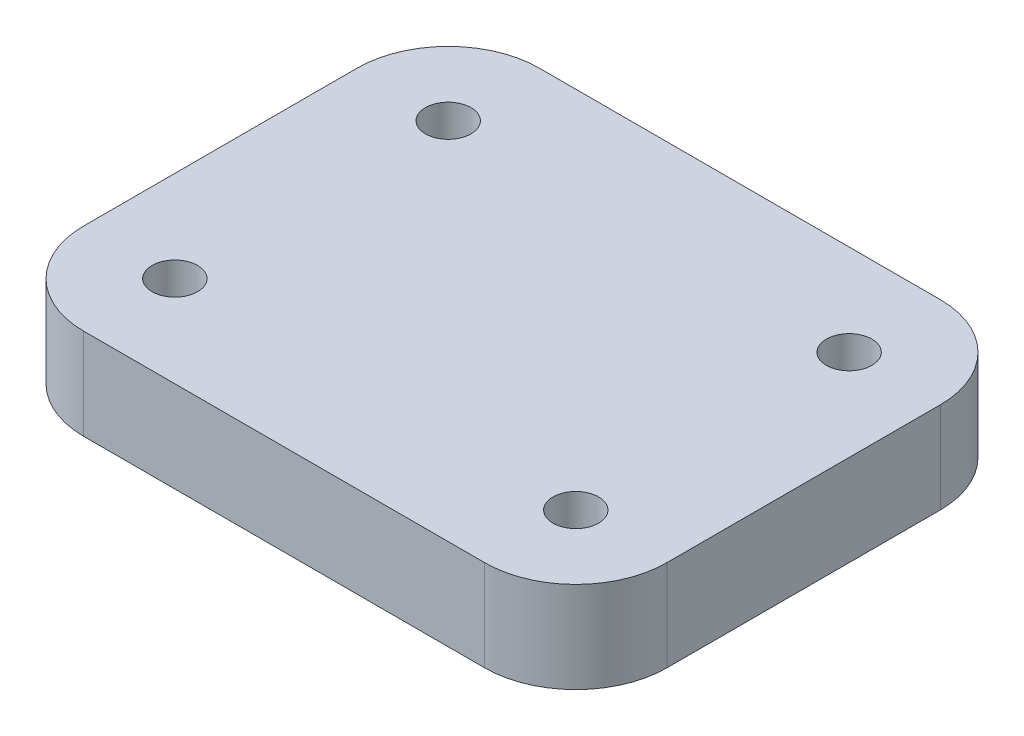
ISO-10303-21;
HEADER;
FILE_DESCRIPTION(('STEP AP214'),'2;1');
FILE_NAME('part.step','',(''),(''),'','','');
FILE_SCHEMA(('AUTOMOTIVE_DESIGN { 1 0 10303 214 1 1 1 1 }'));
ENDSEC;
DATA;
#1=APPLICATION_CONTEXT('core data for automotive mechanical design processes');
#2=APPLICATION_PROTOCOL_DEFINITION('international standard','automotive_design',2000,#1);
#3=PRODUCT_CONTEXT('',#1,'mechanical');
#4=PRODUCT('Part','Part','',(#3));
#5=PRODUCT_RELATED_PRODUCT_CATEGORY('part','',(#4));
#6=PRODUCT_DEFINITION_FORMATION('','',#4);
#7=PRODUCT_DEFINITION_CONTEXT('part definition',#1,'design');
#8=PRODUCT_DEFINITION('design','',#6,#7);
#9=PRODUCT_DEFINITION_SHAPE('','',#8);
#10=(LENGTH_UNIT() NAMED_UNIT(*) SI_UNIT(.MILLI.,.METRE.));
#11=(NAMED_UNIT(*) PLANE_ANGLE_UNIT() SI_UNIT($,.RADIAN.));
#12=(NAMED_UNIT(*) SI_UNIT($,.STERADIAN.) SOLID_ANGLE_UNIT());
#13=UNCERTAINTY_MEASURE_WITH_UNIT(LENGTH_MEASURE(1.E-05),#10,'distance_accuracy_value','');
#14=(GEOMETRIC_REPRESENTATION_CONTEXT(3) GLOBAL_UNCERTAINTY_ASSIGNED_CONTEXT((#13)) GLOBAL_UNIT_ASSIGNED_CONTEXT((#10,
#11,#12)) REPRESENTATION_CONTEXT('',''));
#15=CARTESIAN_POINT('',(0.,0.,0.));
#16=DIRECTION('',(0.,0.,1.));
#17=DIRECTION('',(1.,0.,0.));
#18=AXIS2_PLACEMENT_3D('',#15,#16,#17);
#19=CARTESIAN_POINT('',(0.,18.,0.));
#20=DIRECTION('',(0.,0.,-1.));
#21=DIRECTION('',(-1.,0.,0.));
#22=AXIS2_PLACEMENT_3D('',#19,#20,#21);
#23=PLANE('',#22);
#24=DIRECTION('',(0.,-1.,0.));
#25=VECTOR('',#24,1.);
#26=CARTESIAN_POINT('',(5.,0.,0.));
#27=LINE('',#26,#25);
#28=CARTESIAN_POINT('',(5.,19.,0.));
#29=VERTEX_POINT('',#28);
#30=CARTESIAN_POINT('',(5.,14.,0.));
#31=VERTEX_POINT('',#30);
#32=EDGE_CURVE('E51',#29,#31,#27,.T.);
#33=ORIENTED_EDGE('',*,*,#32,.T.);
#34=DIRECTION('',(1.,0.,0.));
#35=VECTOR('',#34,1.);
#36=CARTESIAN_POINT('',(0.,14.,0.));
#37=LINE('',#36,#35);
#38=CARTESIAN_POINT('',(27.,14.,0.));
#39=VERTEX_POINT('',#38);
#40=EDGE_CURVE('E114',#31,#39,#37,.T.);
#41=ORIENTED_EDGE('',*,*,#40,.T.);
#42=DIRECTION('',(0.,-1.,0.));
#43=VECTOR('',#42,1.);
#44=CARTESIAN_POINT('',(27.,18.,0.));
#45=LINE('',#44,#43);
#46=CARTESIAN_POINT('',(27.,19.,0.));
#47=VERTEX_POINT('',#46);
#48=EDGE_CURVE('E11',#39,#47,#45,.F.);
#49=ORIENTED_EDGE('',*,*,#48,.T.);
#50=DIRECTION('',(1.,0.,0.));
#51=VECTOR('',#50,1.);
#52=CARTESIAN_POINT('',(0.,19.,0.));
#53=LINE('',#52,#51);
#54=EDGE_CURVE('E132',#29,#47,#53,.T.);
#55=ORIENTED_EDGE('',*,*,#54,.F.);
#56=EDGE_LOOP('',(#33,#41,#49,#55));
#57=FACE_BOUND('',#56,.T.);
#58=ADVANCED_FACE('F41',(#57),#23,.F.);
#59=CARTESIAN_POINT('',(27.,18.,-5.));
#60=DIRECTION('',(0.,-1.,0.));
#61=DIRECTION('',(0.,0.,-1.));
#62=AXIS2_PLACEMENT_3D('',#59,#60,#61);
#63=CYLINDRICAL_SURFACE('',#62,1.25);
#64=CARTESIAN_POINT('',(27.,14.,-5.));
#65=DIRECTION('',(0.,1.,0.));
#66=DIRECTION('',(0.,0.,1.));
#67=AXIS2_PLACEMENT_3D('',#64,#65,#66);
#68=CIRCLE('',#67,1.25);
#69=CARTESIAN_POINT('',(27.,14.,-3.75));
#70=VERTEX_POINT('',#69);
#71=EDGE_CURVE('E223',#70,#70,#68,.F.);
#72=ORIENTED_EDGE('',*,*,#71,.T.);
#73=EDGE_LOOP('',(#72));
#74=FACE_BOUND('',#73,.T.);
#75=CARTESIAN_POINT('',(27.,19.,-5.));
#76=DIRECTION('',(0.,1.,0.));
#77=DIRECTION('',(0.,0.,1.));
#78=AXIS2_PLACEMENT_3D('',#75,#76,#77);
#79=CIRCLE('',#78,1.25);
#80=CARTESIAN_POINT('',(27.,19.,-3.75));
#81=VERTEX_POINT('',#80);
#82=EDGE_CURVE('E159',#81,#81,#79,.T.);
#83=ORIENTED_EDGE('',*,*,#82,.T.);
#84=EDGE_LOOP('',(#83));
#85=FACE_BOUND('',#84,.T.);
#86=ADVANCED_FACE('F269',(#74,#85),#63,.F.);
#87=CARTESIAN_POINT('',(5.,18.,-5.));
#88=DIRECTION('',(0.,-1.,0.));
#89=DIRECTION('',(0.,0.,-1.));
#90=AXIS2_PLACEMENT_3D('',#87,#88,#89);
#91=CYLINDRICAL_SURFACE('',#90,1.25);
#92=CARTESIAN_POINT('',(5.,14.,-5.));
#93=DIRECTION('',(0.,1.,0.));
#94=DIRECTION('',(0.,0.,1.));
#95=AXIS2_PLACEMENT_3D('',#92,#93,#94);
#96=CIRCLE('',#95,1.25);
#97=CARTESIAN_POINT('',(5.,14.,-3.75));
#98=VERTEX_POINT('',#97);
#99=EDGE_CURVE('E241',#98,#98,#96,.T.);
#100=ORIENTED_EDGE('',*,*,#99,.F.);
#101=EDGE_LOOP('',(#100));
#102=FACE_BOUND('',#101,.T.);
#103=CARTESIAN_POINT('',(5.,19.,-5.));
#104=DIRECTION('',(0.,1.,0.));
#105=DIRECTION('',(0.,0.,1.));
#106=AXIS2_PLACEMENT_3D('',#103,#104,#105);
#107=CIRCLE('',#106,1.25);
#108=CARTESIAN_POINT('',(5.,19.,-3.75));
#109=VERTEX_POINT('',#108);
#110=EDGE_CURVE('E138',#109,#109,#107,.T.);
#111=ORIENTED_EDGE('',*,*,#110,.T.);
#112=EDGE_LOOP('',(#111));
#113=FACE_BOUND('',#112,.T.);
#114=ADVANCED_FACE('F184',(#102,#113),#91,.F.);
#115=CARTESIAN_POINT('',(0.,19.,0.));
#116=DIRECTION('',(0.,-1.,0.));
#117=DIRECTION('',(0.,0.,-1.));
#118=AXIS2_PLACEMENT_3D('',#115,#116,#117);
#119=PLANE('',#118);
#120=DIRECTION('',(0.,0.,-1.));
#121=VECTOR('',#120,1.);
#122=CARTESIAN_POINT('',(0.,19.,0.));
#123=LINE('',#122,#121);
#124=CARTESIAN_POINT('',(0.,19.,-5.));
#125=VERTEX_POINT('',#124);
#126=CARTESIAN_POINT('',(0.,19.,-20.));
#127=VERTEX_POINT('',#126);
#128=EDGE_CURVE('E203',#125,#127,#123,.T.);
#129=ORIENTED_EDGE('',*,*,#128,.F.);
#130=CARTESIAN_POINT('',(5.,19.,-5.));
#131=DIRECTION('',(0.,-1.,0.));
#132=DIRECTION('',(0.,0.,-1.));
#133=AXIS2_PLACEMENT_3D('',#130,#131,#132);
#134=CIRCLE('',#133,5.);
#135=EDGE_CURVE('E63',#125,#29,#134,.F.);
#136=ORIENTED_EDGE('',*,*,#135,.T.);
#137=ORIENTED_EDGE('',*,*,#54,.T.);
#138=CARTESIAN_POINT('',(27.,19.,-5.));
#139=DIRECTION('',(0.,-1.,0.));
#140=DIRECTION('',(0.,0.,-1.));
#141=AXIS2_PLACEMENT_3D('',#138,#139,#140);
#142=CIRCLE('',#141,5.);
#143=CARTESIAN_POINT('',(32.,19.,-5.));
#144=VERTEX_POINT('',#143);
#145=EDGE_CURVE('E136',#47,#144,#142,.F.);
#146=ORIENTED_EDGE('',*,*,#145,.T.);
#147=DIRECTION('',(0.,0.,1.));
#148=VECTOR('',#147,1.);
#149=CARTESIAN_POINT('',(32.,19.,0.));
#150=LINE('',#149,#148);
#151=CARTESIAN_POINT('',(32.,19.,-20.));
#152=VERTEX_POINT('',#151);
#153=EDGE_CURVE('E220',#152,#144,#150,.T.);
#154=ORIENTED_EDGE('',*,*,#153,.F.);
#155=CARTESIAN_POINT('',(27.,19.,-20.));
#156=DIRECTION('',(0.,1.,0.));
#157=DIRECTION('',(0.,0.,1.));
#158=AXIS2_PLACEMENT_3D('',#155,#156,#157);
#159=CIRCLE('',#158,5.);
#160=CARTESIAN_POINT('',(27.,19.,-25.));
#161=VERTEX_POINT('',#160);
#162=EDGE_CURVE('E216',#152,#161,#159,.T.);
#163=ORIENTED_EDGE('',*,*,#162,.T.);
#164=DIRECTION('',(1.,0.,0.));
#165=VECTOR('',#164,1.);
#166=CARTESIAN_POINT('',(0.,19.,-25.));
#167=LINE('',#166,#165);
#168=CARTESIAN_POINT('',(5.,19.,-25.));
#169=VERTEX_POINT('',#168);
#170=EDGE_CURVE('E212',#169,#161,#167,.T.);
#171=ORIENTED_EDGE('',*,*,#170,.F.);
#172=CARTESIAN_POINT('',(5.,19.,-20.));
#173=DIRECTION('',(0.,1.,0.));
#174=DIRECTION('',(0.,0.,1.));
#175=AXIS2_PLACEMENT_3D('',#172,#173,#174);
#176=CIRCLE('',#175,5.);
#177=EDGE_CURVE('E206',#169,#127,#176,.T.);
#178=ORIENTED_EDGE('',*,*,#177,.T.);
#179=EDGE_LOOP('',(#129,#136,#137,#146,#154,#163,#171,#178));
#180=FACE_BOUND('',#179,.T.);
#181=ORIENTED_EDGE('',*,*,#110,.F.);
#182=EDGE_LOOP('',(#181));
#183=FACE_BOUND('',#182,.T.);
#184=ORIENTED_EDGE('',*,*,#82,.F.);
#185=EDGE_LOOP('',(#184));
#186=FACE_BOUND('',#185,.T.);
#187=CARTESIAN_POINT('',(27.,19.,-20.));
#188=DIRECTION('',(0.,1.,0.));
#189=DIRECTION('',(0.,0.,1.));
#190=AXIS2_PLACEMENT_3D('',#187,#188,#189);
#191=CIRCLE('',#190,1.25);
#192=CARTESIAN_POINT('',(27.,19.,-18.75));
#193=VERTEX_POINT('',#192);
#194=EDGE_CURVE('E193',#193,#193,#191,.T.);
#195=ORIENTED_EDGE('',*,*,#194,.F.);
#196=EDGE_LOOP('',(#195));
#197=FACE_BOUND('',#196,.T.);
#198=CARTESIAN_POINT('',(5.,19.,-20.));
#199=DIRECTION('',(0.,1.,0.));
#200=DIRECTION('',(0.,0.,1.));
#201=AXIS2_PLACEMENT_3D('',#198,#199,#200);
#202=CIRCLE('',#201,1.25);
#203=CARTESIAN_POINT('',(5.,19.,-18.75));
#204=VERTEX_POINT('',#203);
#205=EDGE_CURVE('E172',#204,#204,#202,.T.);
#206=ORIENTED_EDGE('',*,*,#205,.F.);
#207=EDGE_LOOP('',(#206));
#208=FACE_BOUND('',#207,.T.);
#209=ADVANCED_FACE('F147',(#180,#183,#186,#197,#208),#119,.F.);
#210=CARTESIAN_POINT('',(27.,18.,-5.));
#211=DIRECTION('',(0.,-1.,0.));
#212=DIRECTION('',(0.,0.,-1.));
#213=AXIS2_PLACEMENT_3D('',#210,#211,#212);
#214=CYLINDRICAL_SURFACE('',#213,5.);
#215=CARTESIAN_POINT('',(27.,14.,-5.));
#216=DIRECTION('',(0.,1.,0.));
#217=DIRECTION('',(0.,0.,1.));
#218=AXIS2_PLACEMENT_3D('',#215,#216,#217);
#219=CIRCLE('',#218,5.);
#220=CARTESIAN_POINT('',(32.,14.,-5.));
#221=VERTEX_POINT('',#220);
#222=EDGE_CURVE('E155',#221,#39,#219,.F.);
#223=ORIENTED_EDGE('',*,*,#222,.F.);
#224=DIRECTION('',(0.,-1.,0.));
#225=VECTOR('',#224,1.);
#226=CARTESIAN_POINT('',(32.,18.,-5.));
#227=LINE('',#226,#225);
#228=EDGE_CURVE('E45',#144,#221,#227,.T.);
#229=ORIENTED_EDGE('',*,*,#228,.F.);
#230=ORIENTED_EDGE('',*,*,#145,.F.);
#231=ORIENTED_EDGE('',*,*,#48,.F.);
#232=EDGE_LOOP('',(#223,#229,#230,#231));
#233=FACE_BOUND('',#232,.T.);
#234=ADVANCED_FACE('F153',(#233),#214,.T.);
#235=CARTESIAN_POINT('',(5.,18.,-5.));
#236=DIRECTION('',(0.,1.,0.));
#237=DIRECTION('',(0.,0.,1.));
#238=AXIS2_PLACEMENT_3D('',#235,#236,#237);
#239=CYLINDRICAL_SURFACE('',#238,5.);
#240=CARTESIAN_POINT('',(5.,14.,-5.));
#241=DIRECTION('',(0.,1.,0.));
#242=DIRECTION('',(0.,0.,1.));
#243=AXIS2_PLACEMENT_3D('',#240,#241,#242);
#244=CIRCLE('',#243,5.);
#245=CARTESIAN_POINT('',(0.,14.,-5.));
#246=VERTEX_POINT('',#245);
#247=EDGE_CURVE('E107',#31,#246,#244,.F.);
#248=ORIENTED_EDGE('',*,*,#247,.F.);
#249=ORIENTED_EDGE('',*,*,#32,.F.);
#250=ORIENTED_EDGE('',*,*,#135,.F.);
#251=DIRECTION('',(0.,-1.,0.));
#252=VECTOR('',#251,1.);
#253=CARTESIAN_POINT('',(0.,18.,-5.));
#254=LINE('',#253,#252);
#255=EDGE_CURVE('E124',#125,#246,#254,.T.);
#256=ORIENTED_EDGE('',*,*,#255,.T.);
#257=EDGE_LOOP('',(#248,#249,#250,#256));
#258=FACE_BOUND('',#257,.T.);
#259=ADVANCED_FACE('F43',(#258),#239,.T.);
#260=CARTESIAN_POINT('',(32.,14.,0.));
#261=DIRECTION('',(-1.,0.,0.));
#262=DIRECTION('',(0.,0.,1.));
#263=AXIS2_PLACEMENT_3D('',#260,#261,#262);
#264=PLANE('',#263);
#265=ORIENTED_EDGE('',*,*,#153,.T.);
#266=ORIENTED_EDGE('',*,*,#228,.T.);
#267=DIRECTION('',(0.,0.,1.));
#268=VECTOR('',#267,1.);
#269=CARTESIAN_POINT('',(32.,14.,0.));
#270=LINE('',#269,#268);
#271=CARTESIAN_POINT('',(32.,14.,-20.));
#272=VERTEX_POINT('',#271);
#273=EDGE_CURVE('E198',#272,#221,#270,.T.);
#274=ORIENTED_EDGE('',*,*,#273,.F.);
#275=DIRECTION('',(0.,1.,0.));
#276=VECTOR('',#275,1.);
#277=CARTESIAN_POINT('',(32.,14.,-20.));
#278=LINE('',#277,#276);
#279=EDGE_CURVE('E177',#272,#152,#278,.T.);
#280=ORIENTED_EDGE('',*,*,#279,.T.);
#281=EDGE_LOOP('',(#265,#266,#274,#280));
#282=FACE_BOUND('',#281,.T.);
#283=ADVANCED_FACE('F249',(#282),#264,.F.);
#284=CARTESIAN_POINT('',(0.,14.,0.));
#285=DIRECTION('',(1.,0.,0.));
#286=DIRECTION('',(0.,0.,-1.));
#287=AXIS2_PLACEMENT_3D('',#284,#285,#286);
#288=PLANE('',#287);
#289=ORIENTED_EDGE('',*,*,#128,.T.);
#290=DIRECTION('',(0.,1.,0.));
#291=VECTOR('',#290,1.);
#292=CARTESIAN_POINT('',(0.,14.,-20.));
#293=LINE('',#292,#291);
#294=CARTESIAN_POINT('',(0.,14.,-20.));
#295=VERTEX_POINT('',#294);
#296=EDGE_CURVE('E125',#295,#127,#293,.T.);
#297=ORIENTED_EDGE('',*,*,#296,.F.);
#298=DIRECTION('',(0.,0.,-1.));
#299=VECTOR('',#298,1.);
#300=CARTESIAN_POINT('',(0.,14.,0.));
#301=LINE('',#300,#299);
#302=EDGE_CURVE('E112',#246,#295,#301,.T.);
#303=ORIENTED_EDGE('',*,*,#302,.F.);
#304=ORIENTED_EDGE('',*,*,#255,.F.);
#305=EDGE_LOOP('',(#289,#297,#303,#304));
#306=FACE_BOUND('',#305,.T.);
#307=ADVANCED_FACE('F123',(#306),#288,.F.);
#308=CARTESIAN_POINT('',(5.,14.,-20.));
#309=DIRECTION('',(0.,1.,0.));
#310=DIRECTION('',(0.,0.,1.));
#311=AXIS2_PLACEMENT_3D('',#308,#309,#310);
#312=CYLINDRICAL_SURFACE('',#311,5.);
#313=ORIENTED_EDGE('',*,*,#177,.F.);
#314=DIRECTION('',(0.,1.,0.));
#315=VECTOR('',#314,1.);
#316=CARTESIAN_POINT('',(5.,14.,-25.));
#317=LINE('',#316,#315);
#318=CARTESIAN_POINT('',(5.,14.,-25.));
#319=VERTEX_POINT('',#318);
#320=EDGE_CURVE('E164',#319,#169,#317,.T.);
#321=ORIENTED_EDGE('',*,*,#320,.F.);
#322=CARTESIAN_POINT('',(5.,14.,-20.));
#323=DIRECTION('',(0.,1.,0.));
#324=DIRECTION('',(0.,0.,1.));
#325=AXIS2_PLACEMENT_3D('',#322,#323,#324);
#326=CIRCLE('',#325,5.);
#327=EDGE_CURVE('E129',#319,#295,#326,.T.);
#328=ORIENTED_EDGE('',*,*,#327,.T.);
#329=ORIENTED_EDGE('',*,*,#296,.T.);
#330=EDGE_LOOP('',(#313,#321,#328,#329));
#331=FACE_BOUND('',#330,.T.);
#332=ADVANCED_FACE('F258',(#331),#312,.T.);
#333=CARTESIAN_POINT('',(0.,14.,-25.));
#334=DIRECTION('',(0.,0.,1.));
#335=DIRECTION('',(1.,0.,0.));
#336=AXIS2_PLACEMENT_3D('',#333,#334,#335);
#337=PLANE('',#336);
#338=ORIENTED_EDGE('',*,*,#170,.T.);
#339=DIRECTION('',(0.,1.,0.));
#340=VECTOR('',#339,1.);
#341=CARTESIAN_POINT('',(27.,14.,-25.));
#342=LINE('',#341,#340);
#343=CARTESIAN_POINT('',(27.,14.,-25.));
#344=VERTEX_POINT('',#343);
#345=EDGE_CURVE('E169',#344,#161,#342,.T.);
#346=ORIENTED_EDGE('',*,*,#345,.F.);
#347=DIRECTION('',(1.,0.,0.));
#348=VECTOR('',#347,1.);
#349=CARTESIAN_POINT('',(0.,14.,-25.));
#350=LINE('',#349,#348);
#351=EDGE_CURVE('E232',#319,#344,#350,.T.);
#352=ORIENTED_EDGE('',*,*,#351,.F.);
#353=ORIENTED_EDGE('',*,*,#320,.T.);
#354=EDGE_LOOP('',(#338,#346,#352,#353));
#355=FACE_BOUND('',#354,.T.);
#356=ADVANCED_FACE('F257',(#355),#337,.F.);
#357=CARTESIAN_POINT('',(27.,14.,-20.));
#358=DIRECTION('',(0.,1.,0.));
#359=DIRECTION('',(0.,0.,1.));
#360=AXIS2_PLACEMENT_3D('',#357,#358,#359);
#361=CYLINDRICAL_SURFACE('',#360,1.25);
#362=CARTESIAN_POINT('',(27.,14.,-20.));
#363=DIRECTION('',(0.,1.,0.));
#364=DIRECTION('',(0.,0.,1.));
#365=AXIS2_PLACEMENT_3D('',#362,#363,#364);
#366=CIRCLE('',#365,1.25);
#367=CARTESIAN_POINT('',(27.,14.,-18.75));
#368=VERTEX_POINT('',#367);
#369=EDGE_CURVE('E128',#368,#368,#366,.T.);
#370=ORIENTED_EDGE('',*,*,#369,.F.);
#371=EDGE_LOOP('',(#370));
#372=FACE_BOUND('',#371,.T.);
#373=ORIENTED_EDGE('',*,*,#194,.T.);
#374=EDGE_LOOP('',(#373));
#375=FACE_BOUND('',#374,.T.);
#376=ADVANCED_FACE('F265',(#372,#375),#361,.F.);
#377=CARTESIAN_POINT('',(27.,14.,-20.));
#378=DIRECTION('',(0.,1.,0.));
#379=DIRECTION('',(0.,0.,1.));
#380=AXIS2_PLACEMENT_3D('',#377,#378,#379);
#381=CYLINDRICAL_SURFACE('',#380,5.);
#382=ORIENTED_EDGE('',*,*,#162,.F.);
#383=ORIENTED_EDGE('',*,*,#279,.F.);
#384=CARTESIAN_POINT('',(27.,14.,-20.));
#385=DIRECTION('',(0.,1.,0.));
#386=DIRECTION('',(0.,0.,1.));
#387=AXIS2_PLACEMENT_3D('',#384,#385,#386);
#388=CIRCLE('',#387,5.);
#389=EDGE_CURVE('E201',#272,#344,#388,.T.);
#390=ORIENTED_EDGE('',*,*,#389,.T.);
#391=ORIENTED_EDGE('',*,*,#345,.T.);
#392=EDGE_LOOP('',(#382,#383,#390,#391));
#393=FACE_BOUND('',#392,.T.);
#394=ADVANCED_FACE('F253',(#393),#381,.T.);
#395=CARTESIAN_POINT('',(5.,14.,-20.));
#396=DIRECTION('',(0.,1.,0.));
#397=DIRECTION('',(0.,0.,1.));
#398=AXIS2_PLACEMENT_3D('',#395,#396,#397);
#399=CYLINDRICAL_SURFACE('',#398,1.25);
#400=CARTESIAN_POINT('',(5.,14.,-20.));
#401=DIRECTION('',(0.,1.,0.));
#402=DIRECTION('',(0.,0.,1.));
#403=AXIS2_PLACEMENT_3D('',#400,#401,#402);
#404=CIRCLE('',#403,1.25);
#405=CARTESIAN_POINT('',(5.,14.,-18.75));
#406=VERTEX_POINT('',#405);
#407=EDGE_CURVE('E179',#406,#406,#404,.T.);
#408=ORIENTED_EDGE('',*,*,#407,.F.);
#409=EDGE_LOOP('',(#408));
#410=FACE_BOUND('',#409,.T.);
#411=ORIENTED_EDGE('',*,*,#205,.T.);
#412=EDGE_LOOP('',(#411));
#413=FACE_BOUND('',#412,.T.);
#414=ADVANCED_FACE('F297',(#410,#413),#399,.F.);
#415=CARTESIAN_POINT('',(0.,14.,0.));
#416=DIRECTION('',(0.,1.,0.));
#417=DIRECTION('',(0.,0.,1.));
#418=AXIS2_PLACEMENT_3D('',#415,#416,#417);
#419=PLANE('',#418);
#420=ORIENTED_EDGE('',*,*,#247,.T.);
#421=ORIENTED_EDGE('',*,*,#302,.T.);
#422=ORIENTED_EDGE('',*,*,#327,.F.);
#423=ORIENTED_EDGE('',*,*,#351,.T.);
#424=ORIENTED_EDGE('',*,*,#389,.F.);
#425=ORIENTED_EDGE('',*,*,#273,.T.);
#426=ORIENTED_EDGE('',*,*,#222,.T.);
#427=ORIENTED_EDGE('',*,*,#40,.F.);
#428=EDGE_LOOP('',(#420,#421,#422,#423,#424,#425,#426,#427));
#429=FACE_BOUND('',#428,.T.);
#430=ORIENTED_EDGE('',*,*,#369,.T.);
#431=EDGE_LOOP('',(#430));
#432=FACE_BOUND('',#431,.T.);
#433=ORIENTED_EDGE('',*,*,#407,.T.);
#434=EDGE_LOOP('',(#433));
#435=FACE_BOUND('',#434,.T.);
#436=ORIENTED_EDGE('',*,*,#99,.T.);
#437=EDGE_LOOP('',(#436));
#438=FACE_BOUND('',#437,.T.);
#439=ORIENTED_EDGE('',*,*,#71,.F.);
#440=EDGE_LOOP('',(#439));
#441=FACE_BOUND('',#440,.T.);
#442=ADVANCED_FACE('F109',(#429,#432,#435,#438,#441),#419,.F.);
#443=CLOSED_SHELL('',(#58,#86,#114,#209,#234,#259,#283,#307,#332,#356,#376,#394,#414,#442));
#444=MANIFOLD_SOLID_BREP('B2',#443);
#445=ADVANCED_BREP_SHAPE_REPRESENTATION('',(#18,#444),#14);
#446=SHAPE_DEFINITION_REPRESENTATION(#9,#445);
ENDSEC;
END-ISO-10303-21;
